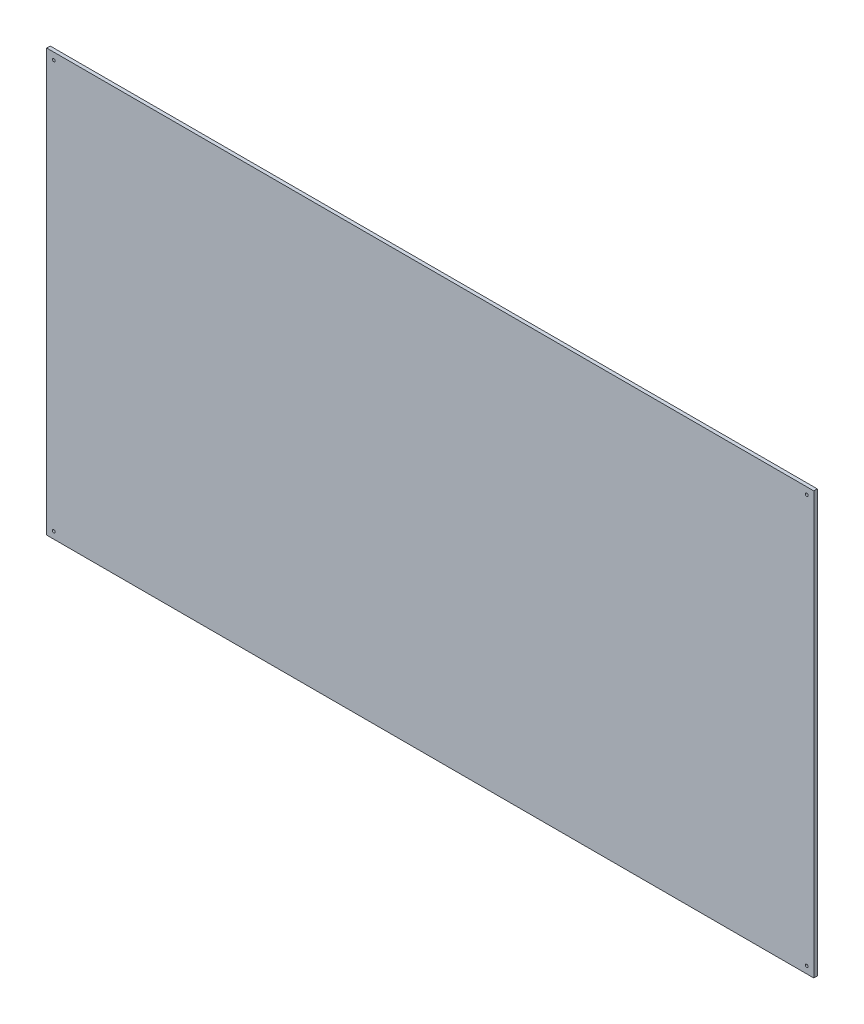
ISO-10303-21;
HEADER;
FILE_DESCRIPTION(('STEP AP214'),'2;1');
FILE_NAME('part.step','',(''),(''),'','','');
FILE_SCHEMA(('AUTOMOTIVE_DESIGN { 1 0 10303 214 1 1 1 1 }'));
ENDSEC;
DATA;
#1=APPLICATION_CONTEXT('core data for automotive mechanical design processes');
#2=APPLICATION_PROTOCOL_DEFINITION('international standard','automotive_design',2000,#1);
#3=PRODUCT_CONTEXT('',#1,'mechanical');
#4=PRODUCT('Part','Part','',(#3));
#5=PRODUCT_RELATED_PRODUCT_CATEGORY('part','',(#4));
#6=PRODUCT_DEFINITION_FORMATION('','',#4);
#7=PRODUCT_DEFINITION_CONTEXT('part definition',#1,'design');
#8=PRODUCT_DEFINITION('design','',#6,#7);
#9=PRODUCT_DEFINITION_SHAPE('','',#8);
#10=(LENGTH_UNIT() NAMED_UNIT(*) SI_UNIT(.MILLI.,.METRE.));
#11=(NAMED_UNIT(*) PLANE_ANGLE_UNIT() SI_UNIT($,.RADIAN.));
#12=(NAMED_UNIT(*) SI_UNIT($,.STERADIAN.) SOLID_ANGLE_UNIT());
#13=UNCERTAINTY_MEASURE_WITH_UNIT(LENGTH_MEASURE(1.E-05),#10,'distance_accuracy_value','');
#14=(GEOMETRIC_REPRESENTATION_CONTEXT(3) GLOBAL_UNCERTAINTY_ASSIGNED_CONTEXT((#13)) GLOBAL_UNIT_ASSIGNED_CONTEXT((#10,
#11,#12)) REPRESENTATION_CONTEXT('',''));
#15=CARTESIAN_POINT('',(0.,0.,0.));
#16=DIRECTION('',(0.,0.,1.));
#17=DIRECTION('',(1.,0.,0.));
#18=AXIS2_PLACEMENT_3D('',#15,#16,#17);
#19=CARTESIAN_POINT('',(-1100.,605.,10.));
#20=DIRECTION('',(1.,0.,0.));
#21=DIRECTION('',(0.,1.,0.));
#22=AXIS2_PLACEMENT_3D('',#19,#20,#21);
#23=PLANE('',#22);
#24=DIRECTION('',(0.,-1.,0.));
#25=VECTOR('',#24,1.);
#26=CARTESIAN_POINT('',(-1100.,605.,0.));
#27=LINE('',#26,#25);
#28=CARTESIAN_POINT('',(-1100.,605.,0.));
#29=VERTEX_POINT('',#28);
#30=CARTESIAN_POINT('',(-1100.,-605.,0.));
#31=VERTEX_POINT('',#30);
#32=EDGE_CURVE('E98',#29,#31,#27,.T.);
#33=ORIENTED_EDGE('',*,*,#32,.T.);
#34=DIRECTION('',(0.,0.,-1.));
#35=VECTOR('',#34,1.);
#36=CARTESIAN_POINT('',(-1100.,-605.,10.));
#37=LINE('',#36,#35);
#38=CARTESIAN_POINT('',(-1100.,-605.,10.));
#39=VERTEX_POINT('',#38);
#40=EDGE_CURVE('E11',#39,#31,#37,.T.);
#41=ORIENTED_EDGE('',*,*,#40,.F.);
#42=DIRECTION('',(0.,-1.,0.));
#43=VECTOR('',#42,1.);
#44=CARTESIAN_POINT('',(-1100.,605.,10.));
#45=LINE('',#44,#43);
#46=CARTESIAN_POINT('',(-1100.,605.,10.));
#47=VERTEX_POINT('',#46);
#48=EDGE_CURVE('E86',#47,#39,#45,.T.);
#49=ORIENTED_EDGE('',*,*,#48,.F.);
#50=DIRECTION('',(0.,0.,-1.));
#51=VECTOR('',#50,1.);
#52=CARTESIAN_POINT('',(-1100.,605.,10.));
#53=LINE('',#52,#51);
#54=EDGE_CURVE('E94',#47,#29,#53,.T.);
#55=ORIENTED_EDGE('',*,*,#54,.T.);
#56=EDGE_LOOP('',(#33,#41,#49,#55));
#57=FACE_BOUND('',#56,.T.);
#58=ADVANCED_FACE('F35',(#57),#23,.F.);
#59=CARTESIAN_POINT('',(-1100.,-605.,10.));
#60=DIRECTION('',(0.,1.,0.));
#61=DIRECTION('',(0.,0.,1.));
#62=AXIS2_PLACEMENT_3D('',#59,#60,#61);
#63=PLANE('',#62);
#64=DIRECTION('',(1.,0.,0.));
#65=VECTOR('',#64,1.);
#66=CARTESIAN_POINT('',(-1100.,-605.,0.));
#67=LINE('',#66,#65);
#68=CARTESIAN_POINT('',(1100.,-605.,0.));
#69=VERTEX_POINT('',#68);
#70=EDGE_CURVE('E90',#31,#69,#67,.T.);
#71=ORIENTED_EDGE('',*,*,#70,.T.);
#72=DIRECTION('',(0.,0.,-1.));
#73=VECTOR('',#72,1.);
#74=CARTESIAN_POINT('',(1100.,-605.,10.));
#75=LINE('',#74,#73);
#76=CARTESIAN_POINT('',(1100.,-605.,10.));
#77=VERTEX_POINT('',#76);
#78=EDGE_CURVE('E43',#77,#69,#75,.T.);
#79=ORIENTED_EDGE('',*,*,#78,.F.);
#80=DIRECTION('',(1.,0.,0.));
#81=VECTOR('',#80,1.);
#82=CARTESIAN_POINT('',(-1100.,-605.,10.));
#83=LINE('',#82,#81);
#84=EDGE_CURVE('E81',#39,#77,#83,.T.);
#85=ORIENTED_EDGE('',*,*,#84,.F.);
#86=ORIENTED_EDGE('',*,*,#40,.T.);
#87=EDGE_LOOP('',(#71,#79,#85,#86));
#88=FACE_BOUND('',#87,.T.);
#89=ADVANCED_FACE('F89',(#88),#63,.F.);
#90=CARTESIAN_POINT('',(1100.,605.,10.));
#91=DIRECTION('',(-1.,0.,0.));
#92=DIRECTION('',(0.,-1.,0.));
#93=AXIS2_PLACEMENT_3D('',#90,#91,#92);
#94=PLANE('',#93);
#95=DIRECTION('',(0.,1.,0.));
#96=VECTOR('',#95,1.);
#97=CARTESIAN_POINT('',(1100.,605.,0.));
#98=LINE('',#97,#96);
#99=CARTESIAN_POINT('',(1100.,605.,0.));
#100=VERTEX_POINT('',#99);
#101=EDGE_CURVE('E68',#69,#100,#98,.T.);
#102=ORIENTED_EDGE('',*,*,#101,.T.);
#103=DIRECTION('',(0.,0.,-1.));
#104=VECTOR('',#103,1.);
#105=CARTESIAN_POINT('',(1100.,605.,10.));
#106=LINE('',#105,#104);
#107=CARTESIAN_POINT('',(1100.,605.,10.));
#108=VERTEX_POINT('',#107);
#109=EDGE_CURVE('E91',#108,#100,#106,.T.);
#110=ORIENTED_EDGE('',*,*,#109,.F.);
#111=DIRECTION('',(0.,1.,0.));
#112=VECTOR('',#111,1.);
#113=CARTESIAN_POINT('',(1100.,605.,10.));
#114=LINE('',#113,#112);
#115=EDGE_CURVE('E84',#77,#108,#114,.T.);
#116=ORIENTED_EDGE('',*,*,#115,.F.);
#117=ORIENTED_EDGE('',*,*,#78,.T.);
#118=EDGE_LOOP('',(#102,#110,#116,#117));
#119=FACE_BOUND('',#118,.T.);
#120=ADVANCED_FACE('F92',(#119),#94,.F.);
#121=CARTESIAN_POINT('',(-1100.,605.,10.));
#122=DIRECTION('',(0.,-1.,0.));
#123=DIRECTION('',(0.,0.,-1.));
#124=AXIS2_PLACEMENT_3D('',#121,#122,#123);
#125=PLANE('',#124);
#126=DIRECTION('',(-1.,0.,0.));
#127=VECTOR('',#126,1.);
#128=CARTESIAN_POINT('',(-1100.,605.,0.));
#129=LINE('',#128,#127);
#130=EDGE_CURVE('E74',#100,#29,#129,.T.);
#131=ORIENTED_EDGE('',*,*,#130,.T.);
#132=ORIENTED_EDGE('',*,*,#54,.F.);
#133=DIRECTION('',(-1.,0.,0.));
#134=VECTOR('',#133,1.);
#135=CARTESIAN_POINT('',(-1100.,605.,10.));
#136=LINE('',#135,#134);
#137=EDGE_CURVE('E51',#108,#47,#136,.T.);
#138=ORIENTED_EDGE('',*,*,#137,.F.);
#139=ORIENTED_EDGE('',*,*,#109,.T.);
#140=EDGE_LOOP('',(#131,#132,#138,#139));
#141=FACE_BOUND('',#140,.T.);
#142=ADVANCED_FACE('F106',(#141),#125,.F.);
#143=CARTESIAN_POINT('',(0.,0.,10.));
#144=DIRECTION('',(0.,0.,1.));
#145=DIRECTION('',(1.,0.,0.));
#146=AXIS2_PLACEMENT_3D('',#143,#144,#145);
#147=PLANE('',#146);
#148=CARTESIAN_POINT('',(-1080.,-585.,10.));
#149=DIRECTION('',(0.,0.,1.));
#150=DIRECTION('',(-1.,0.,0.));
#151=AXIS2_PLACEMENT_3D('',#148,#149,#150);
#152=CIRCLE('',#151,4.05000000000015);
#153=CARTESIAN_POINT('',(-1084.05,-585.,10.));
#154=VERTEX_POINT('',#153);
#155=EDGE_CURVE('E118',#154,#154,#152,.T.);
#156=ORIENTED_EDGE('',*,*,#155,.F.);
#157=EDGE_LOOP('',(#156));
#158=FACE_BOUND('',#157,.T.);
#159=CARTESIAN_POINT('',(1080.,-585.,10.));
#160=DIRECTION('',(0.,0.,1.));
#161=DIRECTION('',(1.,0.,0.));
#162=AXIS2_PLACEMENT_3D('',#159,#160,#161);
#163=CIRCLE('',#162,4.05000000000015);
#164=CARTESIAN_POINT('',(1084.05,-585.,10.));
#165=VERTEX_POINT('',#164);
#166=EDGE_CURVE('E124',#165,#165,#163,.T.);
#167=ORIENTED_EDGE('',*,*,#166,.F.);
#168=EDGE_LOOP('',(#167));
#169=FACE_BOUND('',#168,.T.);
#170=CARTESIAN_POINT('',(1080.,585.,10.));
#171=DIRECTION('',(0.,0.,1.));
#172=DIRECTION('',(-1.,0.,0.));
#173=AXIS2_PLACEMENT_3D('',#170,#171,#172);
#174=CIRCLE('',#173,4.05000000000015);
#175=CARTESIAN_POINT('',(1075.95,585.,10.));
#176=VERTEX_POINT('',#175);
#177=EDGE_CURVE('E130',#176,#176,#174,.T.);
#178=ORIENTED_EDGE('',*,*,#177,.F.);
#179=EDGE_LOOP('',(#178));
#180=FACE_BOUND('',#179,.T.);
#181=CARTESIAN_POINT('',(-1080.,585.,10.));
#182=DIRECTION('',(0.,0.,1.));
#183=DIRECTION('',(1.,0.,0.));
#184=AXIS2_PLACEMENT_3D('',#181,#182,#183);
#185=CIRCLE('',#184,4.05000000000015);
#186=CARTESIAN_POINT('',(-1075.95,585.,10.));
#187=VERTEX_POINT('',#186);
#188=EDGE_CURVE('E112',#187,#187,#185,.T.);
#189=ORIENTED_EDGE('',*,*,#188,.F.);
#190=EDGE_LOOP('',(#189));
#191=FACE_BOUND('',#190,.T.);
#192=ORIENTED_EDGE('',*,*,#48,.T.);
#193=ORIENTED_EDGE('',*,*,#84,.T.);
#194=ORIENTED_EDGE('',*,*,#115,.T.);
#195=ORIENTED_EDGE('',*,*,#137,.T.);
#196=EDGE_LOOP('',(#192,#193,#194,#195));
#197=FACE_BOUND('',#196,.T.);
#198=ADVANCED_FACE('F82',(#158,#169,#180,#191,#197),#147,.T.);
#199=CARTESIAN_POINT('',(0.,0.,0.));
#200=DIRECTION('',(0.,0.,1.));
#201=DIRECTION('',(1.,0.,0.));
#202=AXIS2_PLACEMENT_3D('',#199,#200,#201);
#203=PLANE('',#202);
#204=CARTESIAN_POINT('',(-1080.,-585.,0.));
#205=DIRECTION('',(0.,0.,1.));
#206=DIRECTION('',(-1.,0.,0.));
#207=AXIS2_PLACEMENT_3D('',#204,#205,#206);
#208=CIRCLE('',#207,4.05000000000015);
#209=CARTESIAN_POINT('',(-1084.05,-585.,0.));
#210=VERTEX_POINT('',#209);
#211=EDGE_CURVE('E121',#210,#210,#208,.T.);
#212=ORIENTED_EDGE('',*,*,#211,.T.);
#213=EDGE_LOOP('',(#212));
#214=FACE_BOUND('',#213,.T.);
#215=CARTESIAN_POINT('',(1080.,-585.,0.));
#216=DIRECTION('',(0.,0.,1.));
#217=DIRECTION('',(1.,0.,0.));
#218=AXIS2_PLACEMENT_3D('',#215,#216,#217);
#219=CIRCLE('',#218,4.05000000000015);
#220=CARTESIAN_POINT('',(1084.05,-585.,0.));
#221=VERTEX_POINT('',#220);
#222=EDGE_CURVE('E127',#221,#221,#219,.T.);
#223=ORIENTED_EDGE('',*,*,#222,.T.);
#224=EDGE_LOOP('',(#223));
#225=FACE_BOUND('',#224,.T.);
#226=CARTESIAN_POINT('',(1080.,585.,0.));
#227=DIRECTION('',(0.,0.,1.));
#228=DIRECTION('',(-1.,0.,0.));
#229=AXIS2_PLACEMENT_3D('',#226,#227,#228);
#230=CIRCLE('',#229,4.05000000000015);
#231=CARTESIAN_POINT('',(1075.95,585.,0.));
#232=VERTEX_POINT('',#231);
#233=EDGE_CURVE('E115',#232,#232,#230,.T.);
#234=ORIENTED_EDGE('',*,*,#233,.T.);
#235=EDGE_LOOP('',(#234));
#236=FACE_BOUND('',#235,.T.);
#237=CARTESIAN_POINT('',(-1080.,585.,0.));
#238=DIRECTION('',(0.,0.,1.));
#239=DIRECTION('',(1.,0.,0.));
#240=AXIS2_PLACEMENT_3D('',#237,#238,#239);
#241=CIRCLE('',#240,4.05000000000015);
#242=CARTESIAN_POINT('',(-1075.95,585.,0.));
#243=VERTEX_POINT('',#242);
#244=EDGE_CURVE('E101',#243,#243,#241,.T.);
#245=ORIENTED_EDGE('',*,*,#244,.T.);
#246=EDGE_LOOP('',(#245));
#247=FACE_BOUND('',#246,.T.);
#248=ORIENTED_EDGE('',*,*,#32,.F.);
#249=ORIENTED_EDGE('',*,*,#130,.F.);
#250=ORIENTED_EDGE('',*,*,#101,.F.);
#251=ORIENTED_EDGE('',*,*,#70,.F.);
#252=EDGE_LOOP('',(#248,#249,#250,#251));
#253=FACE_BOUND('',#252,.T.);
#254=ADVANCED_FACE('F109',(#214,#225,#236,#247,#253),#203,.F.);
#255=CARTESIAN_POINT('',(-1080.,585.,0.));
#256=DIRECTION('',(0.,0.,1.));
#257=DIRECTION('',(1.,0.,0.));
#258=AXIS2_PLACEMENT_3D('',#255,#256,#257);
#259=CYLINDRICAL_SURFACE('',#258,4.05000000000015);
#260=ORIENTED_EDGE('',*,*,#244,.F.);
#261=EDGE_LOOP('',(#260));
#262=FACE_BOUND('',#261,.T.);
#263=ORIENTED_EDGE('',*,*,#188,.T.);
#264=EDGE_LOOP('',(#263));
#265=FACE_BOUND('',#264,.T.);
#266=ADVANCED_FACE('F142',(#262,#265),#259,.F.);
#267=CARTESIAN_POINT('',(1080.,585.,0.));
#268=DIRECTION('',(0.,0.,1.));
#269=DIRECTION('',(1.,0.,0.));
#270=AXIS2_PLACEMENT_3D('',#267,#268,#269);
#271=CYLINDRICAL_SURFACE('',#270,4.05000000000015);
#272=ORIENTED_EDGE('',*,*,#233,.F.);
#273=EDGE_LOOP('',(#272));
#274=FACE_BOUND('',#273,.T.);
#275=ORIENTED_EDGE('',*,*,#177,.T.);
#276=EDGE_LOOP('',(#275));
#277=FACE_BOUND('',#276,.T.);
#278=ADVANCED_FACE('F138',(#274,#277),#271,.F.);
#279=CARTESIAN_POINT('',(1080.,-585.,0.));
#280=DIRECTION('',(0.,0.,1.));
#281=DIRECTION('',(1.,0.,0.));
#282=AXIS2_PLACEMENT_3D('',#279,#280,#281);
#283=CYLINDRICAL_SURFACE('',#282,4.05000000000015);
#284=ORIENTED_EDGE('',*,*,#222,.F.);
#285=EDGE_LOOP('',(#284));
#286=FACE_BOUND('',#285,.T.);
#287=ORIENTED_EDGE('',*,*,#166,.T.);
#288=EDGE_LOOP('',(#287));
#289=FACE_BOUND('',#288,.T.);
#290=ADVANCED_FACE('F141',(#286,#289),#283,.F.);
#291=CARTESIAN_POINT('',(-1080.,-585.,0.));
#292=DIRECTION('',(0.,0.,1.));
#293=DIRECTION('',(1.,0.,0.));
#294=AXIS2_PLACEMENT_3D('',#291,#292,#293);
#295=CYLINDRICAL_SURFACE('',#294,4.05000000000015);
#296=ORIENTED_EDGE('',*,*,#211,.F.);
#297=EDGE_LOOP('',(#296));
#298=FACE_BOUND('',#297,.T.);
#299=ORIENTED_EDGE('',*,*,#155,.T.);
#300=EDGE_LOOP('',(#299));
#301=FACE_BOUND('',#300,.T.);
#302=ADVANCED_FACE('F203',(#298,#301),#295,.F.);
#303=CLOSED_SHELL('',(#58,#89,#120,#142,#198,#254,#266,#278,#290,#302));
#304=MANIFOLD_SOLID_BREP('B2',#303);
#305=ADVANCED_BREP_SHAPE_REPRESENTATION('',(#18,#304),#14);
#306=SHAPE_DEFINITION_REPRESENTATION(#9,#305);
ENDSEC;
END-ISO-10303-21;
